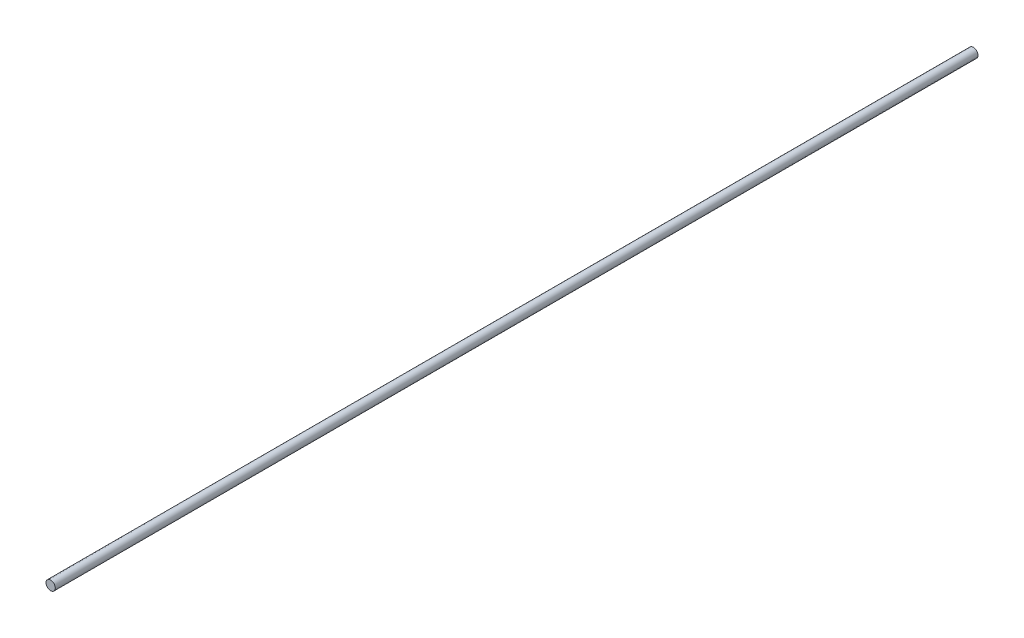
ISO-10303-21;
HEADER;
FILE_DESCRIPTION(('STEP AP214'),'2;1');
FILE_NAME('part.step','',(''),(''),'','','');
FILE_SCHEMA(('AUTOMOTIVE_DESIGN { 1 0 10303 214 1 1 1 1 }'));
ENDSEC;
DATA;
#1=APPLICATION_CONTEXT('core data for automotive mechanical design processes');
#2=APPLICATION_PROTOCOL_DEFINITION('international standard','automotive_design',2000,#1);
#3=PRODUCT_CONTEXT('',#1,'mechanical');
#4=PRODUCT('Part','Part','',(#3));
#5=PRODUCT_RELATED_PRODUCT_CATEGORY('part','',(#4));
#6=PRODUCT_DEFINITION_FORMATION('','',#4);
#7=PRODUCT_DEFINITION_CONTEXT('part definition',#1,'design');
#8=PRODUCT_DEFINITION('design','',#6,#7);
#9=PRODUCT_DEFINITION_SHAPE('','',#8);
#10=(LENGTH_UNIT() NAMED_UNIT(*) SI_UNIT(.MILLI.,.METRE.));
#11=(NAMED_UNIT(*) PLANE_ANGLE_UNIT() SI_UNIT($,.RADIAN.));
#12=(NAMED_UNIT(*) SI_UNIT($,.STERADIAN.) SOLID_ANGLE_UNIT());
#13=UNCERTAINTY_MEASURE_WITH_UNIT(LENGTH_MEASURE(1.E-05),#10,'distance_accuracy_value','');
#14=(GEOMETRIC_REPRESENTATION_CONTEXT(3) GLOBAL_UNCERTAINTY_ASSIGNED_CONTEXT((#13)) GLOBAL_UNIT_ASSIGNED_CONTEXT((#10,
#11,#12)) REPRESENTATION_CONTEXT('',''));
#15=CARTESIAN_POINT('',(0.,0.,0.));
#16=DIRECTION('',(0.,0.,1.));
#17=DIRECTION('',(1.,0.,0.));
#18=AXIS2_PLACEMENT_3D('',#15,#16,#17);
#19=CARTESIAN_POINT('',(0.,0.,397.5));
#20=DIRECTION('',(0.,0.,-1.));
#21=DIRECTION('',(-1.,0.,0.));
#22=AXIS2_PLACEMENT_3D('',#19,#20,#21);
#23=CYLINDRICAL_SURFACE('',#22,4.);
#24=CARTESIAN_POINT('',(0.,0.,397.5));
#25=DIRECTION('',(0.,0.,1.));
#26=DIRECTION('',(1.,0.,0.));
#27=AXIS2_PLACEMENT_3D('',#24,#25,#26);
#28=CIRCLE('',#27,4.);
#29=CARTESIAN_POINT('',(4.,0.,397.5));
#30=VERTEX_POINT('',#29);
#31=EDGE_CURVE('E10',#30,#30,#28,.T.);
#32=ORIENTED_EDGE('',*,*,#31,.F.);
#33=EDGE_LOOP('',(#32));
#34=FACE_BOUND('',#33,.T.);
#35=CARTESIAN_POINT('',(0.,0.,-397.5));
#36=DIRECTION('',(0.,0.,1.));
#37=DIRECTION('',(1.,0.,0.));
#38=AXIS2_PLACEMENT_3D('',#35,#36,#37);
#39=CIRCLE('',#38,4.);
#40=CARTESIAN_POINT('',(4.,0.,-397.5));
#41=VERTEX_POINT('',#40);
#42=EDGE_CURVE('E44',#41,#41,#39,.T.);
#43=ORIENTED_EDGE('',*,*,#42,.T.);
#44=EDGE_LOOP('',(#43));
#45=FACE_BOUND('',#44,.T.);
#46=ADVANCED_FACE('F41',(#34,#45),#23,.T.);
#47=CARTESIAN_POINT('',(0.,0.,397.5));
#48=DIRECTION('',(0.,0.,1.));
#49=DIRECTION('',(1.,0.,0.));
#50=AXIS2_PLACEMENT_3D('',#47,#48,#49);
#51=PLANE('',#50);
#52=ORIENTED_EDGE('',*,*,#31,.T.);
#53=EDGE_LOOP('',(#52));
#54=FACE_BOUND('',#53,.T.);
#55=ADVANCED_FACE('F58',(#54),#51,.T.);
#56=CARTESIAN_POINT('',(0.,0.,-397.5));
#57=DIRECTION('',(0.,0.,1.));
#58=DIRECTION('',(1.,0.,0.));
#59=AXIS2_PLACEMENT_3D('',#56,#57,#58);
#60=PLANE('',#59);
#61=ORIENTED_EDGE('',*,*,#42,.F.);
#62=EDGE_LOOP('',(#61));
#63=FACE_BOUND('',#62,.T.);
#64=ADVANCED_FACE('F56',(#63),#60,.F.);
#65=CLOSED_SHELL('',(#46,#55,#64));
#66=MANIFOLD_SOLID_BREP('B2',#65);
#67=ADVANCED_BREP_SHAPE_REPRESENTATION('',(#18,#66),#14);
#68=SHAPE_DEFINITION_REPRESENTATION(#9,#67);
ENDSEC;
END-ISO-10303-21;
